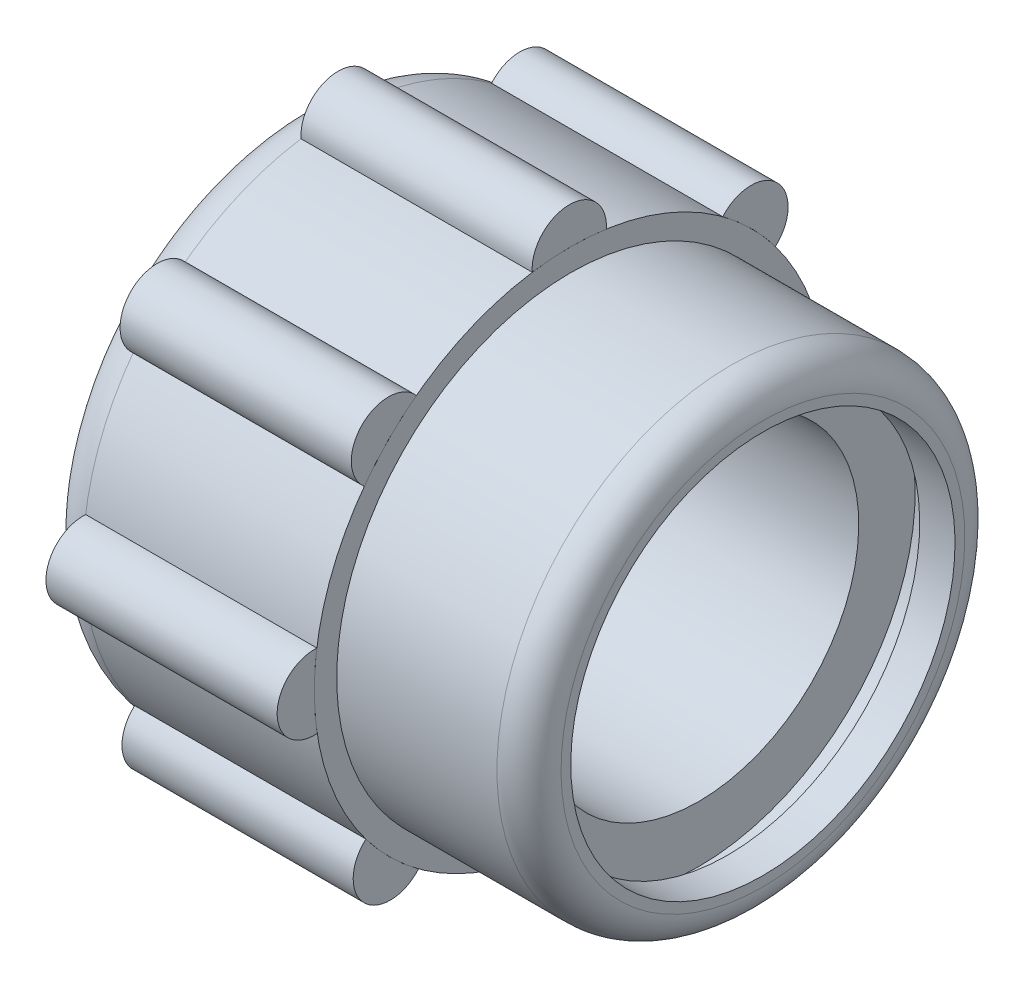
ISO-10303-21;
HEADER;
FILE_DESCRIPTION(('STEP AP214'),'2;1');
FILE_NAME('part.step','',(''),(''),'','','');
FILE_SCHEMA(('AUTOMOTIVE_DESIGN { 1 0 10303 214 1 1 1 1 }'));
ENDSEC;
DATA;
#1=APPLICATION_CONTEXT('core data for automotive mechanical design processes');
#2=APPLICATION_PROTOCOL_DEFINITION('international standard','automotive_design',2000,#1);
#3=PRODUCT_CONTEXT('',#1,'mechanical');
#4=PRODUCT('Part','Part','',(#3));
#5=PRODUCT_RELATED_PRODUCT_CATEGORY('part','',(#4));
#6=PRODUCT_DEFINITION_FORMATION('','',#4);
#7=PRODUCT_DEFINITION_CONTEXT('part definition',#1,'design');
#8=PRODUCT_DEFINITION('design','',#6,#7);
#9=PRODUCT_DEFINITION_SHAPE('','',#8);
#10=(LENGTH_UNIT() NAMED_UNIT(*) SI_UNIT(.MILLI.,.METRE.));
#11=(NAMED_UNIT(*) PLANE_ANGLE_UNIT() SI_UNIT($,.RADIAN.));
#12=(NAMED_UNIT(*) SI_UNIT($,.STERADIAN.) SOLID_ANGLE_UNIT());
#13=UNCERTAINTY_MEASURE_WITH_UNIT(LENGTH_MEASURE(1.E-05),#10,'distance_accuracy_value','');
#14=(GEOMETRIC_REPRESENTATION_CONTEXT(3) GLOBAL_UNCERTAINTY_ASSIGNED_CONTEXT((#13)) GLOBAL_UNIT_ASSIGNED_CONTEXT((#10,
#11,#12)) REPRESENTATION_CONTEXT('',''));
#15=CARTESIAN_POINT('',(0.,0.,0.));
#16=DIRECTION('',(0.,0.,1.));
#17=DIRECTION('',(1.,0.,0.));
#18=AXIS2_PLACEMENT_3D('',#15,#16,#17);
#19=CARTESIAN_POINT('',(11.1329765575221,-4.74660047491274,-6.43970371457865));
#20=CARTESIAN_POINT('',(11.1329765575221,-5.33607054844427,-6.01014296376945));
#21=CARTESIAN_POINT('',(11.1329765575221,-5.95979755095371,-5.40395171328872));
#22=CARTESIAN_POINT('',(11.1329765575221,-6.38386099903755,-4.80838215969926));
#23=B_SPLINE_CURVE_WITH_KNOTS('',3,(#19,#20,#21,#22),.UNSPECIFIED.,.F.,.F.,(4,4),(0.,
0.218343563540382),.UNSPECIFIED.);
#24=DIRECTION('',(-1.,0.,0.));
#25=VECTOR('',#24,1.);
#26=SURFACE_OF_LINEAR_EXTRUSION('',#23,#25);
#27=CARTESIAN_POINT('',(8.5,-4.74660047491274,-6.43970371457865));
#28=CARTESIAN_POINT('',(8.5,-5.33607054844427,-6.01014296376945));
#29=CARTESIAN_POINT('',(8.5,-5.95979755095371,-5.40395171328872));
#30=CARTESIAN_POINT('',(8.5,-6.38386099903755,-4.80838215969926));
#31=B_SPLINE_CURVE_WITH_KNOTS('',3,(#27,#28,#29,#30),.UNSPECIFIED.,.F.,.F.,(4,4),(0.,
0.218343563540382),.UNSPECIFIED.);
#32=CARTESIAN_POINT('',(8.5,-4.74660047491274,-6.43970371457865));
#33=VERTEX_POINT('',#32);
#34=CARTESIAN_POINT('',(8.5,-6.38386099903755,-4.80838215969926));
#35=VERTEX_POINT('',#34);
#36=EDGE_CURVE('E12',#33,#35,#31,.T.);
#37=ORIENTED_EDGE('',*,*,#36,.F.);
#38=DIRECTION('',(-1.,0.,0.));
#39=VECTOR('',#38,1.);
#40=CARTESIAN_POINT('',(11.1329765575221,-4.74660047491274,-6.43970371457865));
#41=LINE('',#40,#39);
#42=CARTESIAN_POINT('',(1.28477957881199,-4.74660047491274,-6.43970371457865));
#43=VERTEX_POINT('',#42);
#44=EDGE_CURVE('E65',#33,#43,#41,.T.);
#45=ORIENTED_EDGE('',*,*,#44,.T.);
#46=CARTESIAN_POINT('',(1.28477957881199,-4.74660047491274,-6.43970371457865));
#47=CARTESIAN_POINT('',(1.28477957881199,-5.33607054844427,-6.01014296376945));
#48=CARTESIAN_POINT('',(1.28477957881199,-5.95979755095371,-5.40395171328872));
#49=CARTESIAN_POINT('',(1.28477957881199,-6.38386099903755,-4.80838215969926));
#50=B_SPLINE_CURVE_WITH_KNOTS('',3,(#46,#47,#48,#49),.UNSPECIFIED.,.F.,.F.,(4,4),(0.,
0.218343563540382),.UNSPECIFIED.);
#51=CARTESIAN_POINT('',(1.28477957881199,-6.38386099903755,-4.80838215969926));
#52=VERTEX_POINT('',#51);
#53=EDGE_CURVE('E78',#43,#52,#50,.T.);
#54=ORIENTED_EDGE('',*,*,#53,.T.);
#55=DIRECTION('',(-1.,0.,0.));
#56=VECTOR('',#55,1.);
#57=CARTESIAN_POINT('',(11.1329765575221,-6.38386099903755,-4.80838215969926));
#58=LINE('',#57,#56);
#59=EDGE_CURVE('E70',#35,#52,#58,.T.);
#60=ORIENTED_EDGE('',*,*,#59,.F.);
#61=EDGE_LOOP('',(#37,#45,#54,#60));
#62=FACE_BOUND('',#61,.T.);
#63=ADVANCED_FACE('F46',(#62),#26,.F.);
#64=CARTESIAN_POINT('',(11.1329765575221,-5.62725822151814,-5.68629623818145));
#65=DIRECTION('',(-1.,0.,0.));
#66=DIRECTION('',(0.,-0.707106781186556,0.707106781186539));
#67=AXIS2_PLACEMENT_3D('',#64,#65,#66);
#68=CYLINDRICAL_SURFACE('',#67,1.15895681202852);
#69=CARTESIAN_POINT('',(8.5,-5.62725822151814,-5.68629623818145));
#70=DIRECTION('',(1.,0.,0.));
#71=DIRECTION('',(0.,0.707106781186556,-0.707106781186539));
#72=AXIS2_PLACEMENT_3D('',#69,#70,#71);
#73=CIRCLE('',#72,1.15895681202852);
#74=EDGE_CURVE('E57',#35,#33,#73,.T.);
#75=ORIENTED_EDGE('',*,*,#74,.F.);
#76=ORIENTED_EDGE('',*,*,#59,.T.);
#77=CARTESIAN_POINT('',(1.28477957881199,-5.62725822151814,-5.68629623818145));
#78=DIRECTION('',(1.,0.,0.));
#79=DIRECTION('',(0.,0.707106781186556,-0.707106781186539));
#80=AXIS2_PLACEMENT_3D('',#77,#78,#79);
#81=CIRCLE('',#80,1.15895681202852);
#82=EDGE_CURVE('E80',#52,#43,#81,.T.);
#83=ORIENTED_EDGE('',*,*,#82,.T.);
#84=ORIENTED_EDGE('',*,*,#44,.F.);
#85=EDGE_LOOP('',(#75,#76,#83,#84));
#86=FACE_BOUND('',#85,.T.);
#87=ADVANCED_FACE('F81',(#86),#68,.T.);
#88=CARTESIAN_POINT('',(1.28477957881199,-5.62725822151803,-5.68629623818155));
#89=DIRECTION('',(-1.,0.,0.));
#90=DIRECTION('',(0.,0.707106781186539,0.707106781186556));
#91=AXIS2_PLACEMENT_3D('',#88,#89,#90);
#92=PLANE('',#91);
#93=ORIENTED_EDGE('',*,*,#53,.F.);
#94=ORIENTED_EDGE('',*,*,#82,.F.);
#95=EDGE_LOOP('',(#93,#94));
#96=FACE_BOUND('',#95,.T.);
#97=ADVANCED_FACE('F84',(#96),#92,.T.);
#98=CARTESIAN_POINT('',(8.5,0.,0.));
#99=DIRECTION('',(1.,0.,0.));
#100=DIRECTION('',(0.,0.707106781186556,-0.707106781186539));
#101=AXIS2_PLACEMENT_3D('',#98,#99,#100);
#102=PLANE('',#101);
#103=ORIENTED_EDGE('',*,*,#74,.T.);
#104=ORIENTED_EDGE('',*,*,#36,.T.);
#105=EDGE_LOOP('',(#103,#104));
#106=FACE_BOUND('',#105,.T.);
#107=ADVANCED_FACE('F48',(#106),#102,.T.);
#108=CLOSED_SHELL('',(#63,#87,#97,#107));
#109=MANIFOLD_SOLID_BREP('B2',#108);
#110=CARTESIAN_POINT('',(11.1329765575221,-7.90991154880486,-1.19720478201666));
#111=CARTESIAN_POINT('',(11.1329765575221,-8.02298451527676,-0.476641175887215));
#112=CARTESIAN_POINT('',(11.1329765575221,-8.03538416444946,0.393042361107246));
#113=CARTESIAN_POINT('',(11.1329765575221,-7.91411103423155,1.11403177091203));
#114=B_SPLINE_CURVE_WITH_KNOTS('',3,(#110,#111,#112,#113),.UNSPECIFIED.,.F.,.F.,(4,4),(0.,
0.218343563540382),.UNSPECIFIED.);
#115=DIRECTION('',(-1.,0.,0.));
#116=VECTOR('',#115,1.);
#117=SURFACE_OF_LINEAR_EXTRUSION('',#114,#116);
#118=CARTESIAN_POINT('',(8.5,-7.90991154880486,-1.19720478201666));
#119=CARTESIAN_POINT('',(8.5,-8.02298451527676,-0.476641175887216));
#120=CARTESIAN_POINT('',(8.5,-8.03538416444946,0.393042361107245));
#121=CARTESIAN_POINT('',(8.5,-7.91411103423155,1.11403177091203));
#122=B_SPLINE_CURVE_WITH_KNOTS('',3,(#118,#119,#120,#121),.UNSPECIFIED.,.F.,.F.,(4,4),(0.,
0.218343563540382),.UNSPECIFIED.);
#123=CARTESIAN_POINT('',(8.5,-7.90991154880486,-1.19720478201666));
#124=VERTEX_POINT('',#123);
#125=CARTESIAN_POINT('',(8.5,-7.91411103423155,1.11403177091203));
#126=VERTEX_POINT('',#125);
#127=EDGE_CURVE('E44',#124,#126,#122,.T.);
#128=ORIENTED_EDGE('',*,*,#127,.F.);
#129=DIRECTION('',(-1.,0.,0.));
#130=VECTOR('',#129,1.);
#131=CARTESIAN_POINT('',(11.1329765575221,-7.90991154880486,-1.19720478201666));
#132=LINE('',#131,#130);
#133=CARTESIAN_POINT('',(1.28477957881199,-7.90991154880486,-1.19720478201666));
#134=VERTEX_POINT('',#133);
#135=EDGE_CURVE('E164',#124,#134,#132,.T.);
#136=ORIENTED_EDGE('',*,*,#135,.T.);
#137=CARTESIAN_POINT('',(1.28477957881199,-7.90991154880486,-1.19720478201666));
#138=CARTESIAN_POINT('',(1.28477957881199,-8.02298451527676,-0.476641175887216));
#139=CARTESIAN_POINT('',(1.28477957881199,-8.03538416444946,0.393042361107245));
#140=CARTESIAN_POINT('',(1.28477957881199,-7.91411103423155,1.11403177091203));
#141=B_SPLINE_CURVE_WITH_KNOTS('',3,(#137,#138,#139,#140),.UNSPECIFIED.,.F.,.F.,(4,4),(0.,
0.218343563540382),.UNSPECIFIED.);
#142=CARTESIAN_POINT('',(1.28477957881199,-7.91411103423155,1.11403177091203));
#143=VERTEX_POINT('',#142);
#144=EDGE_CURVE('E177',#134,#143,#141,.T.);
#145=ORIENTED_EDGE('',*,*,#144,.T.);
#146=DIRECTION('',(-1.,0.,0.));
#147=VECTOR('',#146,1.);
#148=CARTESIAN_POINT('',(11.1329765575221,-7.91411103423155,1.11403177091203));
#149=LINE('',#148,#147);
#150=EDGE_CURVE('E169',#126,#143,#149,.T.);
#151=ORIENTED_EDGE('',*,*,#150,.F.);
#152=EDGE_LOOP('',(#128,#136,#145,#151));
#153=FACE_BOUND('',#152,.T.);
#154=ADVANCED_FACE('F145',(#153),#117,.F.);
#155=CARTESIAN_POINT('',(11.1329765575221,-7.99989107777689,-0.0417461819304121));
#156=DIRECTION('',(-1.,0.,0.));
#157=DIRECTION('',(0.,0.,1.));
#158=AXIS2_PLACEMENT_3D('',#155,#156,#157);
#159=CYLINDRICAL_SURFACE('',#158,1.15895681202852);
#160=CARTESIAN_POINT('',(8.5,-7.99989107777689,-0.0417461819304121));
#161=DIRECTION('',(1.,0.,0.));
#162=DIRECTION('',(0.,0.,-1.));
#163=AXIS2_PLACEMENT_3D('',#160,#161,#162);
#164=CIRCLE('',#163,1.15895681202852);
#165=EDGE_CURVE('E156',#126,#124,#164,.T.);
#166=ORIENTED_EDGE('',*,*,#165,.F.);
#167=ORIENTED_EDGE('',*,*,#150,.T.);
#168=CARTESIAN_POINT('',(1.28477957881199,-7.99989107777689,-0.0417461819304122));
#169=DIRECTION('',(1.,0.,0.));
#170=DIRECTION('',(0.,0.,-1.));
#171=AXIS2_PLACEMENT_3D('',#168,#169,#170);
#172=CIRCLE('',#171,1.15895681202852);
#173=EDGE_CURVE('E179',#143,#134,#172,.T.);
#174=ORIENTED_EDGE('',*,*,#173,.T.);
#175=ORIENTED_EDGE('',*,*,#135,.F.);
#176=EDGE_LOOP('',(#166,#167,#174,#175));
#177=FACE_BOUND('',#176,.T.);
#178=ADVANCED_FACE('F180',(#177),#159,.T.);
#179=CARTESIAN_POINT('',(1.28477957881199,-7.99989107777688,-0.041746181930568));
#180=DIRECTION('',(-1.,0.,0.));
#181=DIRECTION('',(0.,1.,0.));
#182=AXIS2_PLACEMENT_3D('',#179,#180,#181);
#183=PLANE('',#182);
#184=ORIENTED_EDGE('',*,*,#144,.F.);
#185=ORIENTED_EDGE('',*,*,#173,.F.);
#186=EDGE_LOOP('',(#184,#185));
#187=FACE_BOUND('',#186,.T.);
#188=ADVANCED_FACE('F183',(#187),#183,.T.);
#189=CARTESIAN_POINT('',(8.5,0.,0.));
#190=DIRECTION('',(1.,0.,0.));
#191=DIRECTION('',(0.,0.,-1.));
#192=AXIS2_PLACEMENT_3D('',#189,#190,#191);
#193=PLANE('',#192);
#194=ORIENTED_EDGE('',*,*,#165,.T.);
#195=ORIENTED_EDGE('',*,*,#127,.T.);
#196=EDGE_LOOP('',(#194,#195));
#197=FACE_BOUND('',#196,.T.);
#198=ADVANCED_FACE('F147',(#197),#193,.T.);
#199=CLOSED_SHELL('',(#154,#178,#188,#198));
#200=MANIFOLD_SOLID_BREP('B6',#199);
#201=CARTESIAN_POINT('',(11.1329765575221,-6.43970371457864,4.74660047491277));
#202=CARTESIAN_POINT('',(11.1329765575221,-6.01014296376943,5.33607054844429));
#203=CARTESIAN_POINT('',(11.1329765575221,-5.4039517132887,5.95979755095373));
#204=CARTESIAN_POINT('',(11.1329765575221,-4.80838215969924,6.38386099903757));
#205=B_SPLINE_CURVE_WITH_KNOTS('',3,(#201,#202,#203,#204),.UNSPECIFIED.,.F.,.F.,(4,4),(0.,
0.218343563540382),.UNSPECIFIED.);
#206=DIRECTION('',(-1.,0.,0.));
#207=VECTOR('',#206,1.);
#208=SURFACE_OF_LINEAR_EXTRUSION('',#205,#207);
#209=CARTESIAN_POINT('',(8.5,-6.43970371457864,4.74660047491277));
#210=CARTESIAN_POINT('',(8.5,-6.01014296376943,5.33607054844429));
#211=CARTESIAN_POINT('',(8.5,-5.4039517132887,5.95979755095373));
#212=CARTESIAN_POINT('',(8.5,-4.80838215969924,6.38386099903757));
#213=B_SPLINE_CURVE_WITH_KNOTS('',3,(#209,#210,#211,#212),.UNSPECIFIED.,.F.,.F.,(4,4),(0.,
0.218343563540382),.UNSPECIFIED.);
#214=CARTESIAN_POINT('',(8.5,-6.43970371457864,4.74660047491277));
#215=VERTEX_POINT('',#214);
#216=CARTESIAN_POINT('',(8.5,-4.80838215969924,6.38386099903757));
#217=VERTEX_POINT('',#216);
#218=EDGE_CURVE('E143',#215,#217,#213,.T.);
#219=ORIENTED_EDGE('',*,*,#218,.F.);
#220=DIRECTION('',(-1.,0.,0.));
#221=VECTOR('',#220,1.);
#222=CARTESIAN_POINT('',(11.1329765575221,-6.43970371457864,4.74660047491277));
#223=LINE('',#222,#221);
#224=CARTESIAN_POINT('',(1.28477957881199,-6.43970371457864,4.74660047491277));
#225=VERTEX_POINT('',#224);
#226=EDGE_CURVE('E263',#215,#225,#223,.T.);
#227=ORIENTED_EDGE('',*,*,#226,.T.);
#228=CARTESIAN_POINT('',(1.28477957881199,-6.43970371457864,4.74660047491277));
#229=CARTESIAN_POINT('',(1.28477957881199,-6.01014296376943,5.33607054844429));
#230=CARTESIAN_POINT('',(1.28477957881199,-5.4039517132887,5.95979755095373));
#231=CARTESIAN_POINT('',(1.28477957881199,-4.80838215969924,6.38386099903757));
#232=B_SPLINE_CURVE_WITH_KNOTS('',3,(#228,#229,#230,#231),.UNSPECIFIED.,.F.,.F.,(4,4),(0.,
0.218343563540382),.UNSPECIFIED.);
#233=CARTESIAN_POINT('',(1.28477957881199,-4.80838215969924,6.38386099903757));
#234=VERTEX_POINT('',#233);
#235=EDGE_CURVE('E276',#225,#234,#232,.T.);
#236=ORIENTED_EDGE('',*,*,#235,.T.);
#237=DIRECTION('',(-1.,0.,0.));
#238=VECTOR('',#237,1.);
#239=CARTESIAN_POINT('',(11.1329765575221,-4.80838215969924,6.38386099903757));
#240=LINE('',#239,#238);
#241=EDGE_CURVE('E268',#217,#234,#240,.T.);
#242=ORIENTED_EDGE('',*,*,#241,.F.);
#243=EDGE_LOOP('',(#219,#227,#236,#242));
#244=FACE_BOUND('',#243,.T.);
#245=ADVANCED_FACE('F244',(#244),#208,.F.);
#246=CARTESIAN_POINT('',(11.1329765575221,-5.68629623818143,5.62725822151816));
#247=DIRECTION('',(-1.,0.,0.));
#248=DIRECTION('',(0.,0.707106781186541,0.707106781186554));
#249=AXIS2_PLACEMENT_3D('',#246,#247,#248);
#250=CYLINDRICAL_SURFACE('',#249,1.15895681202852);
#251=CARTESIAN_POINT('',(8.5,-5.68629623818143,5.62725822151816));
#252=DIRECTION('',(1.,0.,0.));
#253=DIRECTION('',(0.,-0.707106781186541,-0.707106781186554));
#254=AXIS2_PLACEMENT_3D('',#251,#252,#253);
#255=CIRCLE('',#254,1.15895681202852);
#256=EDGE_CURVE('E255',#217,#215,#255,.T.);
#257=ORIENTED_EDGE('',*,*,#256,.F.);
#258=ORIENTED_EDGE('',*,*,#241,.T.);
#259=CARTESIAN_POINT('',(1.28477957881199,-5.68629623818143,5.62725822151816));
#260=DIRECTION('',(1.,0.,0.));
#261=DIRECTION('',(0.,-0.707106781186541,-0.707106781186554));
#262=AXIS2_PLACEMENT_3D('',#259,#260,#261);
#263=CIRCLE('',#262,1.15895681202852);
#264=EDGE_CURVE('E278',#234,#225,#263,.T.);
#265=ORIENTED_EDGE('',*,*,#264,.T.);
#266=ORIENTED_EDGE('',*,*,#226,.F.);
#267=EDGE_LOOP('',(#257,#258,#265,#266));
#268=FACE_BOUND('',#267,.T.);
#269=ADVANCED_FACE('F279',(#268),#250,.T.);
#270=CARTESIAN_POINT('',(1.28477957881199,-5.68629623818153,5.62725822151805));
#271=DIRECTION('',(-1.,0.,0.));
#272=DIRECTION('',(0.,0.707106781186554,-0.707106781186541));
#273=AXIS2_PLACEMENT_3D('',#270,#271,#272);
#274=PLANE('',#273);
#275=ORIENTED_EDGE('',*,*,#235,.F.);
#276=ORIENTED_EDGE('',*,*,#264,.F.);
#277=EDGE_LOOP('',(#275,#276));
#278=FACE_BOUND('',#277,.T.);
#279=ADVANCED_FACE('F282',(#278),#274,.T.);
#280=CARTESIAN_POINT('',(8.5,0.,0.));
#281=DIRECTION('',(1.,0.,0.));
#282=DIRECTION('',(0.,-0.707106781186541,-0.707106781186554));
#283=AXIS2_PLACEMENT_3D('',#280,#281,#282);
#284=PLANE('',#283);
#285=ORIENTED_EDGE('',*,*,#256,.T.);
#286=ORIENTED_EDGE('',*,*,#218,.T.);
#287=EDGE_LOOP('',(#285,#286));
#288=FACE_BOUND('',#287,.T.);
#289=ADVANCED_FACE('F246',(#288),#284,.T.);
#290=CLOSED_SHELL('',(#245,#269,#279,#289));
#291=MANIFOLD_SOLID_BREP('B38',#290);
#292=CARTESIAN_POINT('',(11.1329765575221,-1.19720478201658,7.90991154880487));
#293=CARTESIAN_POINT('',(11.1329765575221,-0.476641175887131,8.02298451527677));
#294=CARTESIAN_POINT('',(11.1329765575221,0.39304236110733,8.03538416444946));
#295=CARTESIAN_POINT('',(11.1329765575221,1.11403177091211,7.91411103423153));
#296=B_SPLINE_CURVE_WITH_KNOTS('',3,(#292,#293,#294,#295),.UNSPECIFIED.,.F.,.F.,(4,4),(0.,
0.218343563540382),.UNSPECIFIED.);
#297=DIRECTION('',(-1.,0.,0.));
#298=VECTOR('',#297,1.);
#299=SURFACE_OF_LINEAR_EXTRUSION('',#296,#298);
#300=CARTESIAN_POINT('',(8.5,-1.19720478201658,7.90991154880487));
#301=CARTESIAN_POINT('',(8.5,-0.476641175887132,8.02298451527677));
#302=CARTESIAN_POINT('',(8.5,0.39304236110733,8.03538416444946));
#303=CARTESIAN_POINT('',(8.5,1.11403177091211,7.91411103423153));
#304=B_SPLINE_CURVE_WITH_KNOTS('',3,(#300,#301,#302,#303),.UNSPECIFIED.,.F.,.F.,(4,4),(0.,
0.218343563540382),.UNSPECIFIED.);
#305=CARTESIAN_POINT('',(8.5,-1.19720478201658,7.90991154880487));
#306=VERTEX_POINT('',#305);
#307=CARTESIAN_POINT('',(8.5,1.11403177091211,7.91411103423153));
#308=VERTEX_POINT('',#307);
#309=EDGE_CURVE('E242',#306,#308,#304,.T.);
#310=ORIENTED_EDGE('',*,*,#309,.F.);
#311=DIRECTION('',(-1.,0.,0.));
#312=VECTOR('',#311,1.);
#313=CARTESIAN_POINT('',(11.1329765575221,-1.19720478201658,7.90991154880487));
#314=LINE('',#313,#312);
#315=CARTESIAN_POINT('',(1.28477957881199,-1.19720478201658,7.90991154880487));
#316=VERTEX_POINT('',#315);
#317=EDGE_CURVE('E362',#306,#316,#314,.T.);
#318=ORIENTED_EDGE('',*,*,#317,.T.);
#319=CARTESIAN_POINT('',(1.28477957881199,-1.19720478201658,7.90991154880487));
#320=CARTESIAN_POINT('',(1.28477957881199,-0.476641175887132,8.02298451527677));
#321=CARTESIAN_POINT('',(1.28477957881199,0.39304236110733,8.03538416444946));
#322=CARTESIAN_POINT('',(1.28477957881199,1.11403177091211,7.91411103423153));
#323=B_SPLINE_CURVE_WITH_KNOTS('',3,(#319,#320,#321,#322),.UNSPECIFIED.,.F.,.F.,(4,4),(0.,
0.218343563540382),.UNSPECIFIED.);
#324=CARTESIAN_POINT('',(1.28477957881199,1.11403177091211,7.91411103423153));
#325=VERTEX_POINT('',#324);
#326=EDGE_CURVE('E375',#316,#325,#323,.T.);
#327=ORIENTED_EDGE('',*,*,#326,.T.);
#328=DIRECTION('',(-1.,0.,0.));
#329=VECTOR('',#328,1.);
#330=CARTESIAN_POINT('',(11.1329765575221,1.11403177091211,7.91411103423153));
#331=LINE('',#330,#329);
#332=EDGE_CURVE('E367',#308,#325,#331,.T.);
#333=ORIENTED_EDGE('',*,*,#332,.F.);
#334=EDGE_LOOP('',(#310,#318,#327,#333));
#335=FACE_BOUND('',#334,.T.);
#336=ADVANCED_FACE('F343',(#335),#299,.F.);
#337=CARTESIAN_POINT('',(11.1329765575221,-0.0417461819303283,7.99989107777689));
#338=DIRECTION('',(-1.,0.,0.));
#339=DIRECTION('',(0.,1.,0.));
#340=AXIS2_PLACEMENT_3D('',#337,#338,#339);
#341=CYLINDRICAL_SURFACE('',#340,1.15895681202852);
#342=CARTESIAN_POINT('',(8.5,-0.0417461819303283,7.99989107777689));
#343=DIRECTION('',(1.,0.,0.));
#344=DIRECTION('',(0.,-1.,0.));
#345=AXIS2_PLACEMENT_3D('',#342,#343,#344);
#346=CIRCLE('',#345,1.15895681202852);
#347=EDGE_CURVE('E354',#308,#306,#346,.T.);
#348=ORIENTED_EDGE('',*,*,#347,.F.);
#349=ORIENTED_EDGE('',*,*,#332,.T.);
#350=CARTESIAN_POINT('',(1.28477957881199,-0.0417461819303285,7.99989107777689));
#351=DIRECTION('',(1.,0.,0.));
#352=DIRECTION('',(0.,-1.,0.));
#353=AXIS2_PLACEMENT_3D('',#350,#351,#352);
#354=CIRCLE('',#353,1.15895681202852);
#355=EDGE_CURVE('E377',#325,#316,#354,.T.);
#356=ORIENTED_EDGE('',*,*,#355,.T.);
#357=ORIENTED_EDGE('',*,*,#317,.F.);
#358=EDGE_LOOP('',(#348,#349,#356,#357));
#359=FACE_BOUND('',#358,.T.);
#360=ADVANCED_FACE('F378',(#359),#341,.T.);
#361=CARTESIAN_POINT('',(1.28477957881199,-0.0417461819304842,7.99989107777688));
#362=DIRECTION('',(-1.,0.,0.));
#363=DIRECTION('',(0.,0.,-1.));
#364=AXIS2_PLACEMENT_3D('',#361,#362,#363);
#365=PLANE('',#364);
#366=ORIENTED_EDGE('',*,*,#326,.F.);
#367=ORIENTED_EDGE('',*,*,#355,.F.);
#368=EDGE_LOOP('',(#366,#367));
#369=FACE_BOUND('',#368,.T.);
#370=ADVANCED_FACE('F381',(#369),#365,.T.);
#371=CARTESIAN_POINT('',(8.5,0.,0.));
#372=DIRECTION('',(1.,0.,0.));
#373=DIRECTION('',(0.,-1.,0.));
#374=AXIS2_PLACEMENT_3D('',#371,#372,#373);
#375=PLANE('',#374);
#376=ORIENTED_EDGE('',*,*,#347,.T.);
#377=ORIENTED_EDGE('',*,*,#309,.T.);
#378=EDGE_LOOP('',(#376,#377));
#379=FACE_BOUND('',#378,.T.);
#380=ADVANCED_FACE('F345',(#379),#375,.T.);
#381=CLOSED_SHELL('',(#336,#360,#370,#380));
#382=MANIFOLD_SOLID_BREP('B137',#381);
#383=CARTESIAN_POINT('',(11.1329765575221,4.74660047491279,6.43970371457862));
#384=CARTESIAN_POINT('',(11.1329765575221,5.33607054844432,6.01014296376942));
#385=CARTESIAN_POINT('',(11.1329765575221,5.95979755095375,5.40395171328868));
#386=CARTESIAN_POINT('',(11.1329765575221,6.38386099903759,4.80838215969922));
#387=B_SPLINE_CURVE_WITH_KNOTS('',3,(#383,#384,#385,#386),.UNSPECIFIED.,.F.,.F.,(4,4),(0.,
0.218343563540382),.UNSPECIFIED.);
#388=DIRECTION('',(-1.,0.,0.));
#389=VECTOR('',#388,1.);
#390=SURFACE_OF_LINEAR_EXTRUSION('',#387,#389);
#391=CARTESIAN_POINT('',(8.5,4.74660047491279,6.43970371457862));
#392=CARTESIAN_POINT('',(8.5,5.33607054844432,6.01014296376942));
#393=CARTESIAN_POINT('',(8.5,5.95979755095375,5.40395171328868));
#394=CARTESIAN_POINT('',(8.5,6.38386099903759,4.80838215969922));
#395=B_SPLINE_CURVE_WITH_KNOTS('',3,(#391,#392,#393,#394),.UNSPECIFIED.,.F.,.F.,(4,4),(0.,
0.218343563540382),.UNSPECIFIED.);
#396=CARTESIAN_POINT('',(8.5,4.74660047491279,6.43970371457862));
#397=VERTEX_POINT('',#396);
#398=CARTESIAN_POINT('',(8.5,6.38386099903759,4.80838215969922));
#399=VERTEX_POINT('',#398);
#400=EDGE_CURVE('E341',#397,#399,#395,.T.);
#401=ORIENTED_EDGE('',*,*,#400,.F.);
#402=DIRECTION('',(-1.,0.,0.));
#403=VECTOR('',#402,1.);
#404=CARTESIAN_POINT('',(11.1329765575221,4.74660047491279,6.43970371457862));
#405=LINE('',#404,#403);
#406=CARTESIAN_POINT('',(1.28477957881199,4.74660047491279,6.43970371457862));
#407=VERTEX_POINT('',#406);
#408=EDGE_CURVE('E461',#397,#407,#405,.T.);
#409=ORIENTED_EDGE('',*,*,#408,.T.);
#410=CARTESIAN_POINT('',(1.28477957881199,4.74660047491279,6.43970371457862));
#411=CARTESIAN_POINT('',(1.28477957881199,5.33607054844432,6.01014296376942));
#412=CARTESIAN_POINT('',(1.28477957881199,5.95979755095375,5.40395171328868));
#413=CARTESIAN_POINT('',(1.28477957881199,6.38386099903759,4.80838215969922));
#414=B_SPLINE_CURVE_WITH_KNOTS('',3,(#410,#411,#412,#413),.UNSPECIFIED.,.F.,.F.,(4,4),(0.,
0.218343563540382),.UNSPECIFIED.);
#415=CARTESIAN_POINT('',(1.28477957881199,6.38386099903759,4.80838215969922));
#416=VERTEX_POINT('',#415);
#417=EDGE_CURVE('E474',#407,#416,#414,.T.);
#418=ORIENTED_EDGE('',*,*,#417,.T.);
#419=DIRECTION('',(-1.,0.,0.));
#420=VECTOR('',#419,1.);
#421=CARTESIAN_POINT('',(11.1329765575221,6.38386099903759,4.80838215969922));
#422=LINE('',#421,#420);
#423=EDGE_CURVE('E466',#399,#416,#422,.T.);
#424=ORIENTED_EDGE('',*,*,#423,.F.);
#425=EDGE_LOOP('',(#401,#409,#418,#424));
#426=FACE_BOUND('',#425,.T.);
#427=ADVANCED_FACE('F442',(#426),#390,.F.);
#428=CARTESIAN_POINT('',(11.1329765575221,5.62725822151818,5.68629623818141));
#429=DIRECTION('',(-1.,0.,0.));
#430=DIRECTION('',(0.,0.707106781186551,-0.707106781186544));
#431=AXIS2_PLACEMENT_3D('',#428,#429,#430);
#432=CYLINDRICAL_SURFACE('',#431,1.15895681202852);
#433=CARTESIAN_POINT('',(8.5,5.62725822151818,5.68629623818141));
#434=DIRECTION('',(1.,0.,0.));
#435=DIRECTION('',(0.,-0.707106781186551,0.707106781186544));
#436=AXIS2_PLACEMENT_3D('',#433,#434,#435);
#437=CIRCLE('',#436,1.15895681202852);
#438=EDGE_CURVE('E453',#399,#397,#437,.T.);
#439=ORIENTED_EDGE('',*,*,#438,.F.);
#440=ORIENTED_EDGE('',*,*,#423,.T.);
#441=CARTESIAN_POINT('',(1.28477957881199,5.62725822151818,5.68629623818141));
#442=DIRECTION('',(1.,0.,0.));
#443=DIRECTION('',(0.,-0.707106781186551,0.707106781186544));
#444=AXIS2_PLACEMENT_3D('',#441,#442,#443);
#445=CIRCLE('',#444,1.15895681202852);
#446=EDGE_CURVE('E476',#416,#407,#445,.T.);
#447=ORIENTED_EDGE('',*,*,#446,.T.);
#448=ORIENTED_EDGE('',*,*,#408,.F.);
#449=EDGE_LOOP('',(#439,#440,#447,#448));
#450=FACE_BOUND('',#449,.T.);
#451=ADVANCED_FACE('F477',(#450),#432,.T.);
#452=CARTESIAN_POINT('',(1.28477957881199,5.62725822151807,5.68629623818152));
#453=DIRECTION('',(-1.,0.,0.));
#454=DIRECTION('',(0.,-0.707106781186544,-0.707106781186551));
#455=AXIS2_PLACEMENT_3D('',#452,#453,#454);
#456=PLANE('',#455);
#457=ORIENTED_EDGE('',*,*,#417,.F.);
#458=ORIENTED_EDGE('',*,*,#446,.F.);
#459=EDGE_LOOP('',(#457,#458));
#460=FACE_BOUND('',#459,.T.);
#461=ADVANCED_FACE('F480',(#460),#456,.T.);
#462=CARTESIAN_POINT('',(8.5,0.,0.));
#463=DIRECTION('',(1.,0.,0.));
#464=DIRECTION('',(0.,-0.707106781186551,0.707106781186544));
#465=AXIS2_PLACEMENT_3D('',#462,#463,#464);
#466=PLANE('',#465);
#467=ORIENTED_EDGE('',*,*,#438,.T.);
#468=ORIENTED_EDGE('',*,*,#400,.T.);
#469=EDGE_LOOP('',(#467,#468));
#470=FACE_BOUND('',#469,.T.);
#471=ADVANCED_FACE('F444',(#470),#466,.T.);
#472=CLOSED_SHELL('',(#427,#451,#461,#471));
#473=MANIFOLD_SOLID_BREP('B236',#472);
#474=CARTESIAN_POINT('',(11.1329765575221,7.90991154880486,1.19720478201661));
#475=CARTESIAN_POINT('',(11.1329765575221,8.02298451527676,0.476641175887159));
#476=CARTESIAN_POINT('',(11.1329765575221,8.03538416444946,-0.393042361107302));
#477=CARTESIAN_POINT('',(11.1329765575221,7.91411103423154,-1.11403177091209));
#478=B_SPLINE_CURVE_WITH_KNOTS('',3,(#474,#475,#476,#477),.UNSPECIFIED.,.F.,.F.,(4,4),(0.,
0.218343563540382),.UNSPECIFIED.);
#479=DIRECTION('',(-1.,0.,0.));
#480=VECTOR('',#479,1.);
#481=SURFACE_OF_LINEAR_EXTRUSION('',#478,#480);
#482=CARTESIAN_POINT('',(8.5,7.90991154880486,1.19720478201661));
#483=CARTESIAN_POINT('',(8.5,8.02298451527676,0.47664117588716));
#484=CARTESIAN_POINT('',(8.5,8.03538416444946,-0.393042361107302));
#485=CARTESIAN_POINT('',(8.5,7.91411103423154,-1.11403177091209));
#486=B_SPLINE_CURVE_WITH_KNOTS('',3,(#482,#483,#484,#485),.UNSPECIFIED.,.F.,.F.,(4,4),(0.,
0.218343563540382),.UNSPECIFIED.);
#487=CARTESIAN_POINT('',(8.5,7.90991154880486,1.19720478201661));
#488=VERTEX_POINT('',#487);
#489=CARTESIAN_POINT('',(8.5,7.91411103423154,-1.11403177091209));
#490=VERTEX_POINT('',#489);
#491=EDGE_CURVE('E440',#488,#490,#486,.T.);
#492=ORIENTED_EDGE('',*,*,#491,.F.);
#493=DIRECTION('',(-1.,0.,0.));
#494=VECTOR('',#493,1.);
#495=CARTESIAN_POINT('',(11.1329765575221,7.90991154880486,1.19720478201661));
#496=LINE('',#495,#494);
#497=CARTESIAN_POINT('',(1.28477957881199,7.90991154880486,1.19720478201661));
#498=VERTEX_POINT('',#497);
#499=EDGE_CURVE('E560',#488,#498,#496,.T.);
#500=ORIENTED_EDGE('',*,*,#499,.T.);
#501=CARTESIAN_POINT('',(1.28477957881199,7.90991154880486,1.19720478201661));
#502=CARTESIAN_POINT('',(1.28477957881199,8.02298451527676,0.47664117588716));
#503=CARTESIAN_POINT('',(1.28477957881199,8.03538416444946,-0.393042361107301));
#504=CARTESIAN_POINT('',(1.28477957881199,7.91411103423154,-1.11403177091209));
#505=B_SPLINE_CURVE_WITH_KNOTS('',3,(#501,#502,#503,#504),.UNSPECIFIED.,.F.,.F.,(4,4),(0.,
0.218343563540382),.UNSPECIFIED.);
#506=CARTESIAN_POINT('',(1.28477957881199,7.91411103423154,-1.11403177091209));
#507=VERTEX_POINT('',#506);
#508=EDGE_CURVE('E573',#498,#507,#505,.T.);
#509=ORIENTED_EDGE('',*,*,#508,.T.);
#510=DIRECTION('',(-1.,0.,0.));
#511=VECTOR('',#510,1.);
#512=CARTESIAN_POINT('',(11.1329765575221,7.91411103423154,-1.11403177091209));
#513=LINE('',#512,#511);
#514=EDGE_CURVE('E565',#490,#507,#513,.T.);
#515=ORIENTED_EDGE('',*,*,#514,.F.);
#516=EDGE_LOOP('',(#492,#500,#509,#515));
#517=FACE_BOUND('',#516,.T.);
#518=ADVANCED_FACE('F541',(#517),#481,.F.);
#519=CARTESIAN_POINT('',(11.1329765575221,7.99989107777689,0.0417461819303563));
#520=DIRECTION('',(-1.,0.,0.));
#521=DIRECTION('',(0.,0.,-1.));
#522=AXIS2_PLACEMENT_3D('',#519,#520,#521);
#523=CYLINDRICAL_SURFACE('',#522,1.15895681202852);
#524=CARTESIAN_POINT('',(8.5,7.99989107777689,0.0417461819303563));
#525=DIRECTION('',(1.,0.,0.));
#526=DIRECTION('',(0.,0.,1.));
#527=AXIS2_PLACEMENT_3D('',#524,#525,#526);
#528=CIRCLE('',#527,1.15895681202852);
#529=EDGE_CURVE('E552',#490,#488,#528,.T.);
#530=ORIENTED_EDGE('',*,*,#529,.F.);
#531=ORIENTED_EDGE('',*,*,#514,.T.);
#532=CARTESIAN_POINT('',(1.28477957881199,7.99989107777689,0.0417461819303564));
#533=DIRECTION('',(1.,0.,0.));
#534=DIRECTION('',(0.,0.,1.));
#535=AXIS2_PLACEMENT_3D('',#532,#533,#534);
#536=CIRCLE('',#535,1.15895681202852);
#537=EDGE_CURVE('E575',#507,#498,#536,.T.);
#538=ORIENTED_EDGE('',*,*,#537,.T.);
#539=ORIENTED_EDGE('',*,*,#499,.F.);
#540=EDGE_LOOP('',(#530,#531,#538,#539));
#541=FACE_BOUND('',#540,.T.);
#542=ADVANCED_FACE('F576',(#541),#523,.T.);
#543=CARTESIAN_POINT('',(1.28477957881199,7.99989107777688,0.0417461819305121));
#544=DIRECTION('',(-1.,0.,0.));
#545=DIRECTION('',(0.,-1.,0.));
#546=AXIS2_PLACEMENT_3D('',#543,#544,#545);
#547=PLANE('',#546);
#548=ORIENTED_EDGE('',*,*,#508,.F.);
#549=ORIENTED_EDGE('',*,*,#537,.F.);
#550=EDGE_LOOP('',(#548,#549));
#551=FACE_BOUND('',#550,.T.);
#552=ADVANCED_FACE('F579',(#551),#547,.T.);
#553=CARTESIAN_POINT('',(8.5,0.,0.));
#554=DIRECTION('',(1.,0.,0.));
#555=DIRECTION('',(0.,0.,1.));
#556=AXIS2_PLACEMENT_3D('',#553,#554,#555);
#557=PLANE('',#556);
#558=ORIENTED_EDGE('',*,*,#529,.T.);
#559=ORIENTED_EDGE('',*,*,#491,.T.);
#560=EDGE_LOOP('',(#558,#559));
#561=FACE_BOUND('',#560,.T.);
#562=ADVANCED_FACE('F543',(#561),#557,.T.);
#563=CLOSED_SHELL('',(#518,#542,#552,#562));
#564=MANIFOLD_SOLID_BREP('B335',#563);
#565=CARTESIAN_POINT('',(11.1329765575221,6.4397037145786,-4.74660047491281));
#566=CARTESIAN_POINT('',(11.1329765575221,6.0101429637694,-5.33607054844434));
#567=CARTESIAN_POINT('',(11.1329765575221,5.40395171328866,-5.95979755095377));
#568=CARTESIAN_POINT('',(11.1329765575221,4.8083821596992,-6.3838609990376));
#569=B_SPLINE_CURVE_WITH_KNOTS('',3,(#565,#566,#567,#568),.UNSPECIFIED.,.F.,.F.,(4,4),(0.,
0.218343563540382),.UNSPECIFIED.);
#570=DIRECTION('',(-1.,0.,0.));
#571=VECTOR('',#570,1.);
#572=SURFACE_OF_LINEAR_EXTRUSION('',#569,#571);
#573=CARTESIAN_POINT('',(8.5,6.4397037145786,-4.74660047491281));
#574=CARTESIAN_POINT('',(8.5,6.0101429637694,-5.33607054844434));
#575=CARTESIAN_POINT('',(8.5,5.40395171328866,-5.95979755095377));
#576=CARTESIAN_POINT('',(8.5,4.8083821596992,-6.3838609990376));
#577=B_SPLINE_CURVE_WITH_KNOTS('',3,(#573,#574,#575,#576),.UNSPECIFIED.,.F.,.F.,(4,4),(0.,
0.218343563540382),.UNSPECIFIED.);
#578=CARTESIAN_POINT('',(8.5,6.4397037145786,-4.74660047491281));
#579=VERTEX_POINT('',#578);
#580=CARTESIAN_POINT('',(8.5,4.8083821596992,-6.3838609990376));
#581=VERTEX_POINT('',#580);
#582=EDGE_CURVE('E539',#579,#581,#577,.T.);
#583=ORIENTED_EDGE('',*,*,#582,.F.);
#584=DIRECTION('',(-1.,0.,0.));
#585=VECTOR('',#584,1.);
#586=CARTESIAN_POINT('',(11.1329765575221,6.4397037145786,-4.74660047491281));
#587=LINE('',#586,#585);
#588=CARTESIAN_POINT('',(1.28477957881199,6.4397037145786,-4.74660047491281));
#589=VERTEX_POINT('',#588);
#590=EDGE_CURVE('E659',#579,#589,#587,.T.);
#591=ORIENTED_EDGE('',*,*,#590,.T.);
#592=CARTESIAN_POINT('',(1.28477957881199,6.4397037145786,-4.74660047491281));
#593=CARTESIAN_POINT('',(1.28477957881199,6.0101429637694,-5.33607054844434));
#594=CARTESIAN_POINT('',(1.28477957881199,5.40395171328866,-5.95979755095377));
#595=CARTESIAN_POINT('',(1.28477957881199,4.8083821596992,-6.3838609990376));
#596=B_SPLINE_CURVE_WITH_KNOTS('',3,(#592,#593,#594,#595),.UNSPECIFIED.,.F.,.F.,(4,4),(0.,
0.218343563540382),.UNSPECIFIED.);
#597=CARTESIAN_POINT('',(1.28477957881199,4.8083821596992,-6.3838609990376));
#598=VERTEX_POINT('',#597);
#599=EDGE_CURVE('E672',#589,#598,#596,.T.);
#600=ORIENTED_EDGE('',*,*,#599,.T.);
#601=DIRECTION('',(-1.,0.,0.));
#602=VECTOR('',#601,1.);
#603=CARTESIAN_POINT('',(11.1329765575221,4.8083821596992,-6.3838609990376));
#604=LINE('',#603,#602);
#605=EDGE_CURVE('E664',#581,#598,#604,.T.);
#606=ORIENTED_EDGE('',*,*,#605,.F.);
#607=EDGE_LOOP('',(#583,#591,#600,#606));
#608=FACE_BOUND('',#607,.T.);
#609=ADVANCED_FACE('F640',(#608),#572,.F.);
#610=CARTESIAN_POINT('',(11.1329765575221,5.68629623818139,-5.6272582215182));
#611=DIRECTION('',(-1.,0.,0.));
#612=DIRECTION('',(0.,-0.707106781186546,-0.707106781186549));
#613=AXIS2_PLACEMENT_3D('',#610,#611,#612);
#614=CYLINDRICAL_SURFACE('',#613,1.15895681202852);
#615=CARTESIAN_POINT('',(8.5,5.68629623818139,-5.6272582215182));
#616=DIRECTION('',(1.,0.,0.));
#617=DIRECTION('',(0.,0.707106781186546,0.707106781186549));
#618=AXIS2_PLACEMENT_3D('',#615,#616,#617);
#619=CIRCLE('',#618,1.15895681202852);
#620=EDGE_CURVE('E651',#581,#579,#619,.T.);
#621=ORIENTED_EDGE('',*,*,#620,.F.);
#622=ORIENTED_EDGE('',*,*,#605,.T.);
#623=CARTESIAN_POINT('',(1.28477957881199,5.68629623818139,-5.6272582215182));
#624=DIRECTION('',(1.,0.,0.));
#625=DIRECTION('',(0.,0.707106781186546,0.707106781186549));
#626=AXIS2_PLACEMENT_3D('',#623,#624,#625);
#627=CIRCLE('',#626,1.15895681202852);
#628=EDGE_CURVE('E674',#598,#589,#627,.T.);
#629=ORIENTED_EDGE('',*,*,#628,.T.);
#630=ORIENTED_EDGE('',*,*,#590,.F.);
#631=EDGE_LOOP('',(#621,#622,#629,#630));
#632=FACE_BOUND('',#631,.T.);
#633=ADVANCED_FACE('F675',(#632),#614,.T.);
#634=CARTESIAN_POINT('',(1.28477957881199,5.6862962381815,-5.62725822151809));
#635=DIRECTION('',(-1.,0.,0.));
#636=DIRECTION('',(0.,-0.707106781186549,0.707106781186546));
#637=AXIS2_PLACEMENT_3D('',#634,#635,#636);
#638=PLANE('',#637);
#639=ORIENTED_EDGE('',*,*,#599,.F.);
#640=ORIENTED_EDGE('',*,*,#628,.F.);
#641=EDGE_LOOP('',(#639,#640));
#642=FACE_BOUND('',#641,.T.);
#643=ADVANCED_FACE('F678',(#642),#638,.T.);
#644=CARTESIAN_POINT('',(8.5,0.,0.));
#645=DIRECTION('',(1.,0.,0.));
#646=DIRECTION('',(0.,0.707106781186546,0.707106781186549));
#647=AXIS2_PLACEMENT_3D('',#644,#645,#646);
#648=PLANE('',#647);
#649=ORIENTED_EDGE('',*,*,#620,.T.);
#650=ORIENTED_EDGE('',*,*,#582,.T.);
#651=EDGE_LOOP('',(#649,#650));
#652=FACE_BOUND('',#651,.T.);
#653=ADVANCED_FACE('F642',(#652),#648,.T.);
#654=CLOSED_SHELL('',(#609,#633,#643,#653));
#655=MANIFOLD_SOLID_BREP('B434',#654);
#656=CARTESIAN_POINT('',(11.1329765575221,1.19720478201658,-7.90991154880487));
#657=CARTESIAN_POINT('',(11.1329765575221,0.476641175887131,-8.02298451527677));
#658=CARTESIAN_POINT('',(11.1329765575221,-0.39304236110733,-8.03538416444946));
#659=CARTESIAN_POINT('',(11.1329765575221,-1.11403177091211,-7.91411103423153));
#660=B_SPLINE_CURVE_WITH_KNOTS('',3,(#656,#657,#658,#659),.UNSPECIFIED.,.F.,.F.,(4,4),(0.,
0.218343563540382),.UNSPECIFIED.);
#661=DIRECTION('',(-1.,0.,0.));
#662=VECTOR('',#661,1.);
#663=SURFACE_OF_LINEAR_EXTRUSION('',#660,#662);
#664=CARTESIAN_POINT('',(8.5,1.19720478201658,-7.90991154880487));
#665=CARTESIAN_POINT('',(8.5,0.476641175887132,-8.02298451527677));
#666=CARTESIAN_POINT('',(8.5,-0.39304236110733,-8.03538416444946));
#667=CARTESIAN_POINT('',(8.5,-1.11403177091211,-7.91411103423153));
#668=B_SPLINE_CURVE_WITH_KNOTS('',3,(#664,#665,#666,#667),.UNSPECIFIED.,.F.,.F.,(4,4),(0.,
0.218343563540382),.UNSPECIFIED.);
#669=CARTESIAN_POINT('',(8.5,1.19720478201658,-7.90991154880487));
#670=VERTEX_POINT('',#669);
#671=CARTESIAN_POINT('',(8.5,-1.11403177091211,-7.91411103423153));
#672=VERTEX_POINT('',#671);
#673=EDGE_CURVE('E638',#670,#672,#668,.T.);
#674=ORIENTED_EDGE('',*,*,#673,.F.);
#675=DIRECTION('',(-1.,0.,0.));
#676=VECTOR('',#675,1.);
#677=CARTESIAN_POINT('',(11.1329765575221,1.19720478201658,-7.90991154880487));
#678=LINE('',#677,#676);
#679=CARTESIAN_POINT('',(1.28477957881199,1.19720478201658,-7.90991154880487));
#680=VERTEX_POINT('',#679);
#681=EDGE_CURVE('E755',#670,#680,#678,.T.);
#682=ORIENTED_EDGE('',*,*,#681,.T.);
#683=CARTESIAN_POINT('',(1.28477957881199,1.19720478201658,-7.90991154880487));
#684=CARTESIAN_POINT('',(1.28477957881199,0.476641175887132,-8.02298451527677));
#685=CARTESIAN_POINT('',(1.28477957881199,-0.39304236110733,-8.03538416444946));
#686=CARTESIAN_POINT('',(1.28477957881199,-1.11403177091211,-7.91411103423153));
#687=B_SPLINE_CURVE_WITH_KNOTS('',3,(#683,#684,#685,#686),.UNSPECIFIED.,.F.,.F.,(4,4),(0.,
0.218343563540382),.UNSPECIFIED.);
#688=CARTESIAN_POINT('',(1.28477957881199,-1.11403177091211,-7.91411103423153));
#689=VERTEX_POINT('',#688);
#690=EDGE_CURVE('E768',#680,#689,#687,.T.);
#691=ORIENTED_EDGE('',*,*,#690,.T.);
#692=DIRECTION('',(-1.,0.,0.));
#693=VECTOR('',#692,1.);
#694=CARTESIAN_POINT('',(11.1329765575221,-1.11403177091211,-7.91411103423153));
#695=LINE('',#694,#693);
#696=EDGE_CURVE('E760',#672,#689,#695,.T.);
#697=ORIENTED_EDGE('',*,*,#696,.F.);
#698=EDGE_LOOP('',(#674,#682,#691,#697));
#699=FACE_BOUND('',#698,.T.);
#700=ADVANCED_FACE('F736',(#699),#663,.F.);
#701=CARTESIAN_POINT('',(11.1329765575221,0.0417461819303283,-7.99989107777689));
#702=DIRECTION('',(-1.,0.,0.));
#703=DIRECTION('',(0.,-1.,0.));
#704=AXIS2_PLACEMENT_3D('',#701,#702,#703);
#705=CYLINDRICAL_SURFACE('',#704,1.15895681202852);
#706=CARTESIAN_POINT('',(8.5,0.0417461819303283,-7.99989107777689));
#707=DIRECTION('',(1.,0.,0.));
#708=DIRECTION('',(0.,1.,0.));
#709=AXIS2_PLACEMENT_3D('',#706,#707,#708);
#710=CIRCLE('',#709,1.15895681202852);
#711=EDGE_CURVE('E747',#672,#670,#710,.T.);
#712=ORIENTED_EDGE('',*,*,#711,.F.);
#713=ORIENTED_EDGE('',*,*,#696,.T.);
#714=CARTESIAN_POINT('',(1.28477957881199,0.0417461819303285,-7.99989107777689));
#715=DIRECTION('',(1.,0.,0.));
#716=DIRECTION('',(0.,1.,0.));
#717=AXIS2_PLACEMENT_3D('',#714,#715,#716);
#718=CIRCLE('',#717,1.15895681202852);
#719=EDGE_CURVE('E770',#689,#680,#718,.T.);
#720=ORIENTED_EDGE('',*,*,#719,.T.);
#721=ORIENTED_EDGE('',*,*,#681,.F.);
#722=EDGE_LOOP('',(#712,#713,#720,#721));
#723=FACE_BOUND('',#722,.T.);
#724=ADVANCED_FACE('F771',(#723),#705,.T.);
#725=CARTESIAN_POINT('',(1.28477957881199,0.0417461819304842,-7.99989107777688));
#726=DIRECTION('',(-1.,0.,0.));
#727=DIRECTION('',(0.,0.,1.));
#728=AXIS2_PLACEMENT_3D('',#725,#726,#727);
#729=PLANE('',#728);
#730=ORIENTED_EDGE('',*,*,#690,.F.);
#731=ORIENTED_EDGE('',*,*,#719,.F.);
#732=EDGE_LOOP('',(#730,#731));
#733=FACE_BOUND('',#732,.T.);
#734=ADVANCED_FACE('F774',(#733),#729,.T.);
#735=CARTESIAN_POINT('',(8.5,0.,0.));
#736=DIRECTION('',(1.,0.,0.));
#737=DIRECTION('',(0.,1.,0.));
#738=AXIS2_PLACEMENT_3D('',#735,#736,#737);
#739=PLANE('',#738);
#740=ORIENTED_EDGE('',*,*,#711,.T.);
#741=ORIENTED_EDGE('',*,*,#673,.T.);
#742=EDGE_LOOP('',(#740,#741));
#743=FACE_BOUND('',#742,.T.);
#744=ADVANCED_FACE('F738',(#743),#739,.T.);
#745=CLOSED_SHELL('',(#700,#724,#734,#744));
#746=MANIFOLD_SOLID_BREP('B533',#745);
#747=CARTESIAN_POINT('',(0.,0.,0.));
#748=DIRECTION('',(-1.,0.,0.));
#749=DIRECTION('',(0.,-1.,0.));
#750=AXIS2_PLACEMENT_3D('',#747,#748,#749);
#751=CYLINDRICAL_SURFACE('',#750,5.99569563247579);
#752=CARTESIAN_POINT('',(14.5,0.,0.));
#753=DIRECTION('',(-1.,0.,0.));
#754=DIRECTION('',(0.,-1.,0.));
#755=AXIS2_PLACEMENT_3D('',#752,#753,#754);
#756=CIRCLE('',#755,5.99569563247579);
#757=CARTESIAN_POINT('',(14.5,-5.99569563247579,0.));
#758=VERTEX_POINT('',#757);
#759=EDGE_CURVE('E840',#758,#758,#756,.T.);
#760=ORIENTED_EDGE('',*,*,#759,.F.);
#761=EDGE_LOOP('',(#760));
#762=FACE_BOUND('',#761,.T.);
#763=CARTESIAN_POINT('',(13.3973546696229,0.,0.));
#764=DIRECTION('',(-1.,0.,0.));
#765=DIRECTION('',(0.,-1.,0.));
#766=AXIS2_PLACEMENT_3D('',#763,#764,#765);
#767=CIRCLE('',#766,5.99569563247579);
#768=CARTESIAN_POINT('',(13.3973546696229,-5.99569563247579,0.));
#769=VERTEX_POINT('',#768);
#770=EDGE_CURVE('E869',#769,#769,#767,.T.);
#771=ORIENTED_EDGE('',*,*,#770,.T.);
#772=EDGE_LOOP('',(#771));
#773=FACE_BOUND('',#772,.T.);
#774=ADVANCED_FACE('F825',(#762,#773),#751,.F.);
#775=CARTESIAN_POINT('',(14.5,0.,0.));
#776=DIRECTION('',(-1.,0.,0.));
#777=DIRECTION('',(0.,-1.,0.));
#778=AXIS2_PLACEMENT_3D('',#775,#776,#777);
#779=PLANE('',#778);
#780=CARTESIAN_POINT('',(14.5,0.,0.));
#781=DIRECTION('',(-1.,0.,0.));
#782=DIRECTION('',(0.,-1.,0.));
#783=AXIS2_PLACEMENT_3D('',#780,#781,#782);
#784=CIRCLE('',#783,6.3);
#785=CARTESIAN_POINT('',(14.5,-6.3,0.));
#786=VERTEX_POINT('',#785);
#787=EDGE_CURVE('E735',#786,#786,#784,.F.);
#788=ORIENTED_EDGE('',*,*,#787,.T.);
#789=EDGE_LOOP('',(#788));
#790=FACE_BOUND('',#789,.T.);
#791=ORIENTED_EDGE('',*,*,#759,.T.);
#792=EDGE_LOOP('',(#791));
#793=FACE_BOUND('',#792,.T.);
#794=ADVANCED_FACE('F905',(#790,#793),#779,.F.);
#795=CARTESIAN_POINT('',(0.,0.,0.));
#796=DIRECTION('',(-1.,0.,0.));
#797=DIRECTION('',(0.,-1.,0.));
#798=AXIS2_PLACEMENT_3D('',#795,#796,#797);
#799=CYLINDRICAL_SURFACE('',#798,7.3);
#800=CARTESIAN_POINT('',(13.5,0.,0.));
#801=DIRECTION('',(-1.,0.,0.));
#802=DIRECTION('',(0.,-1.,0.));
#803=AXIS2_PLACEMENT_3D('',#800,#801,#802);
#804=CIRCLE('',#803,7.3);
#805=CARTESIAN_POINT('',(13.5,-7.3,0.));
#806=VERTEX_POINT('',#805);
#807=EDGE_CURVE('E832',#806,#806,#804,.T.);
#808=ORIENTED_EDGE('',*,*,#807,.T.);
#809=EDGE_LOOP('',(#808));
#810=FACE_BOUND('',#809,.T.);
#811=CARTESIAN_POINT('',(8.5,0.,0.));
#812=DIRECTION('',(-1.,0.,0.));
#813=DIRECTION('',(0.,-1.,0.));
#814=AXIS2_PLACEMENT_3D('',#811,#812,#813);
#815=CIRCLE('',#814,7.3);
#816=CARTESIAN_POINT('',(8.5,-7.3,0.));
#817=VERTEX_POINT('',#816);
#818=EDGE_CURVE('E845',#817,#817,#815,.T.);
#819=ORIENTED_EDGE('',*,*,#818,.F.);
#820=EDGE_LOOP('',(#819));
#821=FACE_BOUND('',#820,.T.);
#822=ADVANCED_FACE('F911',(#810,#821),#799,.T.);
#823=CARTESIAN_POINT('',(8.5,0.,0.));
#824=DIRECTION('',(1.,0.,0.));
#825=DIRECTION('',(0.,1.,0.));
#826=AXIS2_PLACEMENT_3D('',#823,#824,#825);
#827=PLANE('',#826);
#828=ORIENTED_EDGE('',*,*,#818,.T.);
#829=EDGE_LOOP('',(#828));
#830=FACE_BOUND('',#829,.T.);
#831=CARTESIAN_POINT('',(8.5,0.,0.));
#832=DIRECTION('',(-1.,0.,0.));
#833=DIRECTION('',(0.,-1.,0.));
#834=AXIS2_PLACEMENT_3D('',#831,#832,#833);
#835=CIRCLE('',#834,8.);
#836=CARTESIAN_POINT('',(8.5,-8.,0.));
#837=VERTEX_POINT('',#836);
#838=EDGE_CURVE('E848',#837,#837,#835,.T.);
#839=ORIENTED_EDGE('',*,*,#838,.F.);
#840=EDGE_LOOP('',(#839));
#841=FACE_BOUND('',#840,.T.);
#842=ADVANCED_FACE('F932',(#830,#841),#827,.T.);
#843=CARTESIAN_POINT('',(0.,0.,0.));
#844=DIRECTION('',(-1.,0.,0.));
#845=DIRECTION('',(0.,-1.,0.));
#846=AXIS2_PLACEMENT_3D('',#843,#844,#845);
#847=CYLINDRICAL_SURFACE('',#846,8.);
#848=CARTESIAN_POINT('',(1.28477957881199,0.,0.));
#849=DIRECTION('',(-1.,0.,0.));
#850=DIRECTION('',(0.,-1.,0.));
#851=AXIS2_PLACEMENT_3D('',#848,#849,#850);
#852=CIRCLE('',#851,8.);
#853=CARTESIAN_POINT('',(1.28477957881199,-8.,0.));
#854=VERTEX_POINT('',#853);
#855=EDGE_CURVE('E836',#854,#854,#852,.F.);
#856=ORIENTED_EDGE('',*,*,#855,.T.);
#857=EDGE_LOOP('',(#856));
#858=FACE_BOUND('',#857,.T.);
#859=ORIENTED_EDGE('',*,*,#838,.T.);
#860=EDGE_LOOP('',(#859));
#861=FACE_BOUND('',#860,.T.);
#862=ADVANCED_FACE('F926',(#858,#861),#847,.T.);
#863=CARTESIAN_POINT('',(0.,0.,0.));
#864=DIRECTION('',(-1.,0.,0.));
#865=DIRECTION('',(0.,-1.,0.));
#866=AXIS2_PLACEMENT_3D('',#863,#864,#865);
#867=CYLINDRICAL_SURFACE('',#866,6.89834675159349);
#868=CARTESIAN_POINT('',(0.699999999999999,0.,0.));
#869=DIRECTION('',(-1.,0.,0.));
#870=DIRECTION('',(0.,-1.,0.));
#871=AXIS2_PLACEMENT_3D('',#868,#869,#870);
#872=CIRCLE('',#871,6.89834675159349);
#873=CARTESIAN_POINT('',(0.699999999999999,-6.89834675159349,0.));
#874=VERTEX_POINT('',#873);
#875=EDGE_CURVE('E854',#874,#874,#872,.T.);
#876=ORIENTED_EDGE('',*,*,#875,.F.);
#877=EDGE_LOOP('',(#876));
#878=FACE_BOUND('',#877,.T.);
#879=CARTESIAN_POINT('',(0.,0.,0.));
#880=DIRECTION('',(-1.,0.,0.));
#881=DIRECTION('',(0.,-1.,0.));
#882=AXIS2_PLACEMENT_3D('',#879,#880,#881);
#883=CIRCLE('',#882,6.89834675159349);
#884=CARTESIAN_POINT('',(0.,-6.89834675159349,0.));
#885=VERTEX_POINT('',#884);
#886=EDGE_CURVE('E851',#885,#885,#883,.T.);
#887=ORIENTED_EDGE('',*,*,#886,.T.);
#888=EDGE_LOOP('',(#887));
#889=FACE_BOUND('',#888,.T.);
#890=ADVANCED_FACE('F901',(#878,#889),#867,.F.);
#891=CARTESIAN_POINT('',(0.699999999999999,0.,0.));
#892=DIRECTION('',(1.,0.,0.));
#893=DIRECTION('',(0.,1.,0.));
#894=AXIS2_PLACEMENT_3D('',#891,#892,#893);
#895=PLANE('',#894);
#896=CARTESIAN_POINT('',(0.699999999999999,0.,0.));
#897=DIRECTION('',(-1.,0.,0.));
#898=DIRECTION('',(0.,-1.,0.));
#899=AXIS2_PLACEMENT_3D('',#896,#897,#898);
#900=CIRCLE('',#899,4.99099126868527);
#901=CARTESIAN_POINT('',(0.699999999999999,-4.99099126868527,0.));
#902=VERTEX_POINT('',#901);
#903=EDGE_CURVE('E857',#902,#902,#900,.T.);
#904=ORIENTED_EDGE('',*,*,#903,.F.);
#905=EDGE_LOOP('',(#904));
#906=FACE_BOUND('',#905,.T.);
#907=ORIENTED_EDGE('',*,*,#875,.T.);
#908=EDGE_LOOP('',(#907));
#909=FACE_BOUND('',#908,.T.);
#910=ADVANCED_FACE('F895',(#906,#909),#895,.F.);
#911=CARTESIAN_POINT('',(0.,0.,0.));
#912=DIRECTION('',(-1.,0.,0.));
#913=DIRECTION('',(0.,-1.,0.));
#914=AXIS2_PLACEMENT_3D('',#911,#912,#913);
#915=CYLINDRICAL_SURFACE('',#914,4.99099126868527);
#916=ORIENTED_EDGE('',*,*,#903,.T.);
#917=EDGE_LOOP('',(#916));
#918=FACE_BOUND('',#917,.T.);
#919=CARTESIAN_POINT('',(12.5,0.,0.));
#920=DIRECTION('',(-1.,0.,0.));
#921=DIRECTION('',(0.,-1.,0.));
#922=AXIS2_PLACEMENT_3D('',#919,#920,#921);
#923=CIRCLE('',#922,4.99099126868528);
#924=CARTESIAN_POINT('',(12.5,-4.99099126868528,0.));
#925=VERTEX_POINT('',#924);
#926=EDGE_CURVE('E860',#925,#925,#923,.T.);
#927=ORIENTED_EDGE('',*,*,#926,.F.);
#928=EDGE_LOOP('',(#927));
#929=FACE_BOUND('',#928,.T.);
#930=ADVANCED_FACE('F890',(#918,#929),#915,.F.);
#931=CARTESIAN_POINT('',(12.5,0.,0.));
#932=DIRECTION('',(-1.,0.,0.));
#933=DIRECTION('',(0.,-1.,0.));
#934=AXIS2_PLACEMENT_3D('',#931,#932,#933);
#935=PLANE('',#934);
#936=CARTESIAN_POINT('',(12.5,0.,0.));
#937=DIRECTION('',(-1.,0.,0.));
#938=DIRECTION('',(0.,-1.,0.));
#939=AXIS2_PLACEMENT_3D('',#936,#937,#938);
#940=CIRCLE('',#939,6.75099126868527);
#941=CARTESIAN_POINT('',(12.5,-6.75099126868527,0.));
#942=VERTEX_POINT('',#941);
#943=EDGE_CURVE('E863',#942,#942,#940,.T.);
#944=ORIENTED_EDGE('',*,*,#943,.F.);
#945=EDGE_LOOP('',(#944));
#946=FACE_BOUND('',#945,.T.);
#947=ORIENTED_EDGE('',*,*,#926,.T.);
#948=EDGE_LOOP('',(#947));
#949=FACE_BOUND('',#948,.T.);
#950=ADVANCED_FACE('F884',(#946,#949),#935,.F.);
#951=CARTESIAN_POINT('',(0.,0.,0.));
#952=DIRECTION('',(-1.,0.,0.));
#953=DIRECTION('',(0.,-1.,0.));
#954=AXIS2_PLACEMENT_3D('',#951,#952,#953);
#955=CYLINDRICAL_SURFACE('',#954,6.75099126868527);
#956=CARTESIAN_POINT('',(13.3973546696229,0.,0.));
#957=DIRECTION('',(-1.,0.,0.));
#958=DIRECTION('',(0.,-1.,0.));
#959=AXIS2_PLACEMENT_3D('',#956,#957,#958);
#960=CIRCLE('',#959,6.75099126868527);
#961=CARTESIAN_POINT('',(13.3973546696229,-6.75099126868527,0.));
#962=VERTEX_POINT('',#961);
#963=EDGE_CURVE('E866',#962,#962,#960,.T.);
#964=ORIENTED_EDGE('',*,*,#963,.F.);
#965=EDGE_LOOP('',(#964));
#966=FACE_BOUND('',#965,.T.);
#967=ORIENTED_EDGE('',*,*,#943,.T.);
#968=EDGE_LOOP('',(#967));
#969=FACE_BOUND('',#968,.T.);
#970=ADVANCED_FACE('F878',(#966,#969),#955,.F.);
#971=CARTESIAN_POINT('',(13.3973546696229,0.,0.));
#972=DIRECTION('',(1.,0.,0.));
#973=DIRECTION('',(0.,1.,0.));
#974=AXIS2_PLACEMENT_3D('',#971,#972,#973);
#975=PLANE('',#974);
#976=ORIENTED_EDGE('',*,*,#770,.F.);
#977=EDGE_LOOP('',(#976));
#978=FACE_BOUND('',#977,.T.);
#979=ORIENTED_EDGE('',*,*,#963,.T.);
#980=EDGE_LOOP('',(#979));
#981=FACE_BOUND('',#980,.T.);
#982=ADVANCED_FACE('F874',(#978,#981),#975,.F.);
#983=CARTESIAN_POINT('',(1.28477957881199,0.,0.));
#984=DIRECTION('',(-1.,0.,0.));
#985=DIRECTION('',(0.,-1.,0.));
#986=AXIS2_PLACEMENT_3D('',#983,#984,#985);
#987=TOROIDAL_SURFACE('',#986,6.7,1.3);
#988=ORIENTED_EDGE('',*,*,#855,.F.);
#989=EDGE_LOOP('',(#988));
#990=FACE_BOUND('',#989,.T.);
#991=ORIENTED_EDGE('',*,*,#886,.F.);
#992=EDGE_LOOP('',(#991));
#993=FACE_BOUND('',#992,.T.);
#994=ADVANCED_FACE('F877',(#990,#993),#987,.T.);
#995=CARTESIAN_POINT('',(13.5,0.,0.));
#996=DIRECTION('',(-1.,0.,0.));
#997=DIRECTION('',(0.,-1.,0.));
#998=AXIS2_PLACEMENT_3D('',#995,#996,#997);
#999=TOROIDAL_SURFACE('',#998,6.3,1.);
#1000=ORIENTED_EDGE('',*,*,#787,.F.);
#1001=EDGE_LOOP('',(#1000));
#1002=FACE_BOUND('',#1001,.T.);
#1003=ORIENTED_EDGE('',*,*,#807,.F.);
#1004=EDGE_LOOP('',(#1003));
#1005=FACE_BOUND('',#1004,.T.);
#1006=ADVANCED_FACE('F827',(#1002,#1005),#999,.T.);
#1007=CLOSED_SHELL('',(#774,#794,#822,#842,#862,#890,#910,#930,#950,#970,#982,#994,#1006));
#1008=MANIFOLD_SOLID_BREP('B632',#1007);
#1009=ADVANCED_BREP_SHAPE_REPRESENTATION('',(#18,#109,#200,#291,#382,#473,#564,#655,#746,#1008),#14);
#1010=SHAPE_DEFINITION_REPRESENTATION(#9,#1009);
ENDSEC;
END-ISO-10303-21;
